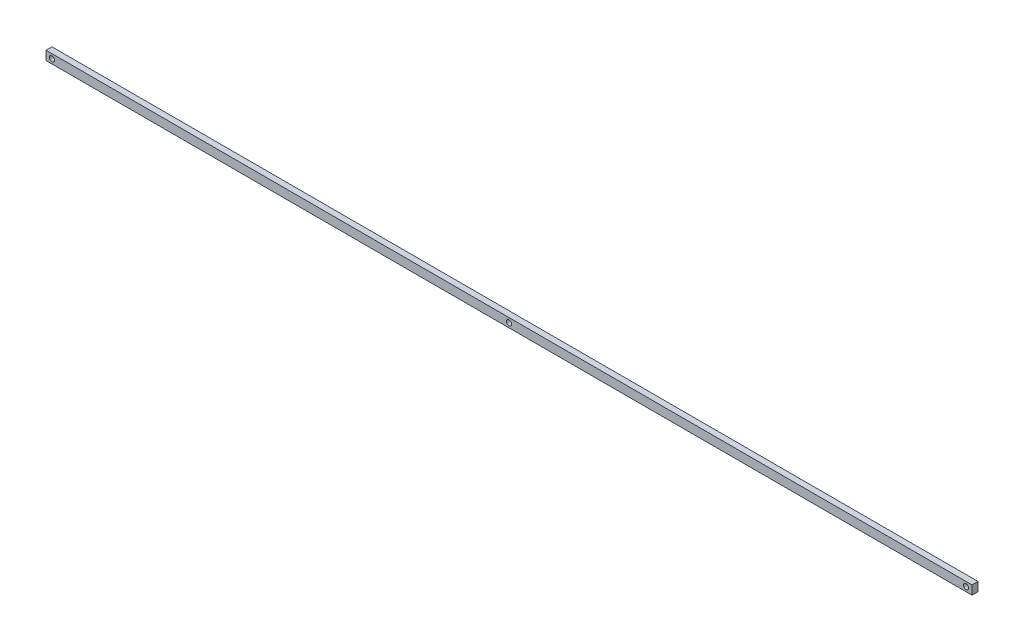
ISO-10303-21;
HEADER;
FILE_DESCRIPTION(('STEP AP214'),'2;1');
FILE_NAME('part.step','',(''),(''),'','','');
FILE_SCHEMA(('AUTOMOTIVE_DESIGN { 1 0 10303 214 1 1 1 1 }'));
ENDSEC;
DATA;
#1=APPLICATION_CONTEXT('core data for automotive mechanical design processes');
#2=APPLICATION_PROTOCOL_DEFINITION('international standard','automotive_design',2000,#1);
#3=PRODUCT_CONTEXT('',#1,'mechanical');
#4=PRODUCT('Part','Part','',(#3));
#5=PRODUCT_RELATED_PRODUCT_CATEGORY('part','',(#4));
#6=PRODUCT_DEFINITION_FORMATION('','',#4);
#7=PRODUCT_DEFINITION_CONTEXT('part definition',#1,'design');
#8=PRODUCT_DEFINITION('design','',#6,#7);
#9=PRODUCT_DEFINITION_SHAPE('','',#8);
#10=(LENGTH_UNIT() NAMED_UNIT(*) SI_UNIT(.MILLI.,.METRE.));
#11=(NAMED_UNIT(*) PLANE_ANGLE_UNIT() SI_UNIT($,.RADIAN.));
#12=(NAMED_UNIT(*) SI_UNIT($,.STERADIAN.) SOLID_ANGLE_UNIT());
#13=UNCERTAINTY_MEASURE_WITH_UNIT(LENGTH_MEASURE(1.E-05),#10,'distance_accuracy_value','');
#14=(GEOMETRIC_REPRESENTATION_CONTEXT(3) GLOBAL_UNCERTAINTY_ASSIGNED_CONTEXT((#13)) GLOBAL_UNIT_ASSIGNED_CONTEXT((#10,
#11,#12)) REPRESENTATION_CONTEXT('',''));
#15=CARTESIAN_POINT('',(0.,0.,0.));
#16=DIRECTION('',(0.,0.,1.));
#17=DIRECTION('',(1.,0.,0.));
#18=AXIS2_PLACEMENT_3D('',#15,#16,#17);
#19=CARTESIAN_POINT('',(0.,0.,10.));
#20=DIRECTION('',(1.,0.,0.));
#21=DIRECTION('',(0.,0.,-1.));
#22=AXIS2_PLACEMENT_3D('',#19,#20,#21);
#23=PLANE('',#22);
#24=DIRECTION('',(0.,-1.,0.));
#25=VECTOR('',#24,1.);
#26=CARTESIAN_POINT('',(0.,0.,0.));
#27=LINE('',#26,#25);
#28=CARTESIAN_POINT('',(0.,15.,0.));
#29=VERTEX_POINT('',#28);
#30=CARTESIAN_POINT('',(0.,0.,0.));
#31=VERTEX_POINT('',#30);
#32=EDGE_CURVE('E112',#29,#31,#27,.T.);
#33=ORIENTED_EDGE('',*,*,#32,.T.);
#34=DIRECTION('',(0.,0.,-1.));
#35=VECTOR('',#34,1.);
#36=CARTESIAN_POINT('',(0.,0.,10.));
#37=LINE('',#36,#35);
#38=CARTESIAN_POINT('',(0.,0.,10.));
#39=VERTEX_POINT('',#38);
#40=EDGE_CURVE('E11',#39,#31,#37,.T.);
#41=ORIENTED_EDGE('',*,*,#40,.F.);
#42=DIRECTION('',(0.,-1.,0.));
#43=VECTOR('',#42,1.);
#44=CARTESIAN_POINT('',(0.,0.,10.));
#45=LINE('',#44,#43);
#46=CARTESIAN_POINT('',(0.,15.,10.));
#47=VERTEX_POINT('',#46);
#48=EDGE_CURVE('E96',#47,#39,#45,.T.);
#49=ORIENTED_EDGE('',*,*,#48,.F.);
#50=DIRECTION('',(0.,0.,-1.));
#51=VECTOR('',#50,1.);
#52=CARTESIAN_POINT('',(0.,15.,10.));
#53=LINE('',#52,#51);
#54=EDGE_CURVE('E108',#47,#29,#53,.T.);
#55=ORIENTED_EDGE('',*,*,#54,.T.);
#56=EDGE_LOOP('',(#33,#41,#49,#55));
#57=FACE_BOUND('',#56,.T.);
#58=ADVANCED_FACE('F44',(#57),#23,.F.);
#59=CARTESIAN_POINT('',(0.,0.,10.));
#60=DIRECTION('',(0.,1.,0.));
#61=DIRECTION('',(0.,0.,1.));
#62=AXIS2_PLACEMENT_3D('',#59,#60,#61);
#63=PLANE('',#62);
#64=DIRECTION('',(1.,0.,0.));
#65=VECTOR('',#64,1.);
#66=CARTESIAN_POINT('',(0.,0.,0.));
#67=LINE('',#66,#65);
#68=CARTESIAN_POINT('',(1556.,0.,0.));
#69=VERTEX_POINT('',#68);
#70=EDGE_CURVE('E101',#31,#69,#67,.T.);
#71=ORIENTED_EDGE('',*,*,#70,.T.);
#72=DIRECTION('',(0.,0.,-1.));
#73=VECTOR('',#72,1.);
#74=CARTESIAN_POINT('',(1556.,0.,10.));
#75=LINE('',#74,#73);
#76=CARTESIAN_POINT('',(1556.,0.,10.));
#77=VERTEX_POINT('',#76);
#78=EDGE_CURVE('E53',#77,#69,#75,.T.);
#79=ORIENTED_EDGE('',*,*,#78,.F.);
#80=DIRECTION('',(1.,0.,0.));
#81=VECTOR('',#80,1.);
#82=CARTESIAN_POINT('',(0.,0.,10.));
#83=LINE('',#82,#81);
#84=EDGE_CURVE('E91',#39,#77,#83,.T.);
#85=ORIENTED_EDGE('',*,*,#84,.F.);
#86=ORIENTED_EDGE('',*,*,#40,.T.);
#87=EDGE_LOOP('',(#71,#79,#85,#86));
#88=FACE_BOUND('',#87,.T.);
#89=ADVANCED_FACE('F100',(#88),#63,.F.);
#90=CARTESIAN_POINT('',(1556.,0.,10.));
#91=DIRECTION('',(-1.,0.,0.));
#92=DIRECTION('',(0.,0.,1.));
#93=AXIS2_PLACEMENT_3D('',#90,#91,#92);
#94=PLANE('',#93);
#95=DIRECTION('',(0.,1.,0.));
#96=VECTOR('',#95,1.);
#97=CARTESIAN_POINT('',(1556.,0.,0.));
#98=LINE('',#97,#96);
#99=CARTESIAN_POINT('',(1556.,15.,0.));
#100=VERTEX_POINT('',#99);
#101=EDGE_CURVE('E78',#69,#100,#98,.T.);
#102=ORIENTED_EDGE('',*,*,#101,.T.);
#103=DIRECTION('',(0.,0.,-1.));
#104=VECTOR('',#103,1.);
#105=CARTESIAN_POINT('',(1556.,15.,10.));
#106=LINE('',#105,#104);
#107=CARTESIAN_POINT('',(1556.,15.,10.));
#108=VERTEX_POINT('',#107);
#109=EDGE_CURVE('E103',#108,#100,#106,.T.);
#110=ORIENTED_EDGE('',*,*,#109,.F.);
#111=DIRECTION('',(0.,1.,0.));
#112=VECTOR('',#111,1.);
#113=CARTESIAN_POINT('',(1556.,0.,10.));
#114=LINE('',#113,#112);
#115=EDGE_CURVE('E94',#77,#108,#114,.T.);
#116=ORIENTED_EDGE('',*,*,#115,.F.);
#117=ORIENTED_EDGE('',*,*,#78,.T.);
#118=EDGE_LOOP('',(#102,#110,#116,#117));
#119=FACE_BOUND('',#118,.T.);
#120=ADVANCED_FACE('F104',(#119),#94,.F.);
#121=CARTESIAN_POINT('',(0.,15.,10.));
#122=DIRECTION('',(0.,-1.,0.));
#123=DIRECTION('',(0.,0.,-1.));
#124=AXIS2_PLACEMENT_3D('',#121,#122,#123);
#125=PLANE('',#124);
#126=DIRECTION('',(-1.,0.,0.));
#127=VECTOR('',#126,1.);
#128=CARTESIAN_POINT('',(0.,15.,0.));
#129=LINE('',#128,#127);
#130=EDGE_CURVE('E84',#100,#29,#129,.T.);
#131=ORIENTED_EDGE('',*,*,#130,.T.);
#132=ORIENTED_EDGE('',*,*,#54,.F.);
#133=DIRECTION('',(-1.,0.,0.));
#134=VECTOR('',#133,1.);
#135=CARTESIAN_POINT('',(0.,15.,10.));
#136=LINE('',#135,#134);
#137=EDGE_CURVE('E61',#108,#47,#136,.T.);
#138=ORIENTED_EDGE('',*,*,#137,.F.);
#139=ORIENTED_EDGE('',*,*,#109,.T.);
#140=EDGE_LOOP('',(#131,#132,#138,#139));
#141=FACE_BOUND('',#140,.T.);
#142=ADVANCED_FACE('F126',(#141),#125,.F.);
#143=CARTESIAN_POINT('',(0.,0.,10.));
#144=DIRECTION('',(0.,0.,-1.));
#145=DIRECTION('',(-1.,0.,0.));
#146=AXIS2_PLACEMENT_3D('',#143,#144,#145);
#147=PLANE('',#146);
#148=CARTESIAN_POINT('',(10.,7.5,10.));
#149=DIRECTION('',(0.,0.,1.));
#150=DIRECTION('',(1.,0.,0.));
#151=AXIS2_PLACEMENT_3D('',#148,#149,#150);
#152=CIRCLE('',#151,4.255);
#153=CARTESIAN_POINT('',(14.255,7.5,10.));
#154=VERTEX_POINT('',#153);
#155=EDGE_CURVE('E146',#154,#154,#152,.T.);
#156=ORIENTED_EDGE('',*,*,#155,.F.);
#157=EDGE_LOOP('',(#156));
#158=FACE_BOUND('',#157,.T.);
#159=CARTESIAN_POINT('',(1546.,7.5,10.));
#160=DIRECTION('',(0.,0.,1.));
#161=DIRECTION('',(1.,0.,0.));
#162=AXIS2_PLACEMENT_3D('',#159,#160,#161);
#163=CIRCLE('',#162,4.25499999999999);
#164=CARTESIAN_POINT('',(1550.255,7.5,10.));
#165=VERTEX_POINT('',#164);
#166=EDGE_CURVE('E142',#165,#165,#163,.T.);
#167=ORIENTED_EDGE('',*,*,#166,.F.);
#168=EDGE_LOOP('',(#167));
#169=FACE_BOUND('',#168,.T.);
#170=CARTESIAN_POINT('',(778.,7.5,10.));
#171=DIRECTION('',(0.,0.,1.));
#172=DIRECTION('',(1.,0.,0.));
#173=AXIS2_PLACEMENT_3D('',#170,#171,#172);
#174=CIRCLE('',#173,4.255);
#175=CARTESIAN_POINT('',(782.255,7.5,10.));
#176=VERTEX_POINT('',#175);
#177=EDGE_CURVE('E133',#176,#176,#174,.T.);
#178=ORIENTED_EDGE('',*,*,#177,.F.);
#179=EDGE_LOOP('',(#178));
#180=FACE_BOUND('',#179,.T.);
#181=ORIENTED_EDGE('',*,*,#48,.T.);
#182=ORIENTED_EDGE('',*,*,#84,.T.);
#183=ORIENTED_EDGE('',*,*,#115,.T.);
#184=ORIENTED_EDGE('',*,*,#137,.T.);
#185=EDGE_LOOP('',(#181,#182,#183,#184));
#186=FACE_BOUND('',#185,.T.);
#187=ADVANCED_FACE('F92',(#158,#169,#180,#186),#147,.F.);
#188=CARTESIAN_POINT('',(0.,0.,0.));
#189=DIRECTION('',(0.,0.,-1.));
#190=DIRECTION('',(-1.,0.,0.));
#191=AXIS2_PLACEMENT_3D('',#188,#189,#190);
#192=PLANE('',#191);
#193=CARTESIAN_POINT('',(10.,7.5,0.));
#194=DIRECTION('',(0.,0.,-1.));
#195=DIRECTION('',(-1.,0.,0.));
#196=AXIS2_PLACEMENT_3D('',#193,#194,#195);
#197=CIRCLE('',#196,4.255);
#198=CARTESIAN_POINT('',(5.745,7.5,0.));
#199=VERTEX_POINT('',#198);
#200=EDGE_CURVE('E116',#199,#199,#197,.F.);
#201=ORIENTED_EDGE('',*,*,#200,.T.);
#202=EDGE_LOOP('',(#201));
#203=FACE_BOUND('',#202,.T.);
#204=CARTESIAN_POINT('',(1546.,7.5,0.));
#205=DIRECTION('',(0.,0.,-1.));
#206=DIRECTION('',(-1.,0.,0.));
#207=AXIS2_PLACEMENT_3D('',#204,#205,#206);
#208=CIRCLE('',#207,4.25499999999999);
#209=CARTESIAN_POINT('',(1541.745,7.5,0.));
#210=VERTEX_POINT('',#209);
#211=EDGE_CURVE('E137',#210,#210,#208,.F.);
#212=ORIENTED_EDGE('',*,*,#211,.T.);
#213=EDGE_LOOP('',(#212));
#214=FACE_BOUND('',#213,.T.);
#215=CARTESIAN_POINT('',(778.,7.5,0.));
#216=DIRECTION('',(0.,0.,-1.));
#217=DIRECTION('',(-1.,0.,0.));
#218=AXIS2_PLACEMENT_3D('',#215,#216,#217);
#219=CIRCLE('',#218,4.255);
#220=CARTESIAN_POINT('',(773.745,7.5,0.));
#221=VERTEX_POINT('',#220);
#222=EDGE_CURVE('E138',#221,#221,#219,.F.);
#223=ORIENTED_EDGE('',*,*,#222,.T.);
#224=EDGE_LOOP('',(#223));
#225=FACE_BOUND('',#224,.T.);
#226=ORIENTED_EDGE('',*,*,#32,.F.);
#227=ORIENTED_EDGE('',*,*,#130,.F.);
#228=ORIENTED_EDGE('',*,*,#101,.F.);
#229=ORIENTED_EDGE('',*,*,#70,.F.);
#230=EDGE_LOOP('',(#226,#227,#228,#229));
#231=FACE_BOUND('',#230,.T.);
#232=ADVANCED_FACE('F129',(#203,#214,#225,#231),#192,.T.);
#233=CARTESIAN_POINT('',(778.,7.5,-12.034957415795));
#234=DIRECTION('',(0.,0.,1.));
#235=DIRECTION('',(1.,0.,0.));
#236=AXIS2_PLACEMENT_3D('',#233,#234,#235);
#237=CYLINDRICAL_SURFACE('',#236,4.255);
#238=ORIENTED_EDGE('',*,*,#177,.T.);
#239=EDGE_LOOP('',(#238));
#240=FACE_BOUND('',#239,.T.);
#241=ORIENTED_EDGE('',*,*,#222,.F.);
#242=EDGE_LOOP('',(#241));
#243=FACE_BOUND('',#242,.T.);
#244=ADVANCED_FACE('F167',(#240,#243),#237,.F.);
#245=CARTESIAN_POINT('',(1546.,7.5,-12.034957415795));
#246=DIRECTION('',(0.,0.,1.));
#247=DIRECTION('',(1.,0.,0.));
#248=AXIS2_PLACEMENT_3D('',#245,#246,#247);
#249=CYLINDRICAL_SURFACE('',#248,4.25499999999999);
#250=ORIENTED_EDGE('',*,*,#166,.T.);
#251=EDGE_LOOP('',(#250));
#252=FACE_BOUND('',#251,.T.);
#253=ORIENTED_EDGE('',*,*,#211,.F.);
#254=EDGE_LOOP('',(#253));
#255=FACE_BOUND('',#254,.T.);
#256=ADVANCED_FACE('F170',(#252,#255),#249,.F.);
#257=CARTESIAN_POINT('',(10.,7.5,-12.034957415795));
#258=DIRECTION('',(0.,0.,1.));
#259=DIRECTION('',(1.,0.,0.));
#260=AXIS2_PLACEMENT_3D('',#257,#258,#259);
#261=CYLINDRICAL_SURFACE('',#260,4.255);
#262=ORIENTED_EDGE('',*,*,#155,.T.);
#263=EDGE_LOOP('',(#262));
#264=FACE_BOUND('',#263,.T.);
#265=ORIENTED_EDGE('',*,*,#200,.F.);
#266=EDGE_LOOP('',(#265));
#267=FACE_BOUND('',#266,.T.);
#268=ADVANCED_FACE('F157',(#264,#267),#261,.F.);
#269=CLOSED_SHELL('',(#58,#89,#120,#142,#187,#232,#244,#256,#268));
#270=MANIFOLD_SOLID_BREP('B2',#269);
#271=ADVANCED_BREP_SHAPE_REPRESENTATION('',(#18,#270),#14);
#272=SHAPE_DEFINITION_REPRESENTATION(#9,#271);
ENDSEC;
END-ISO-10303-21;
